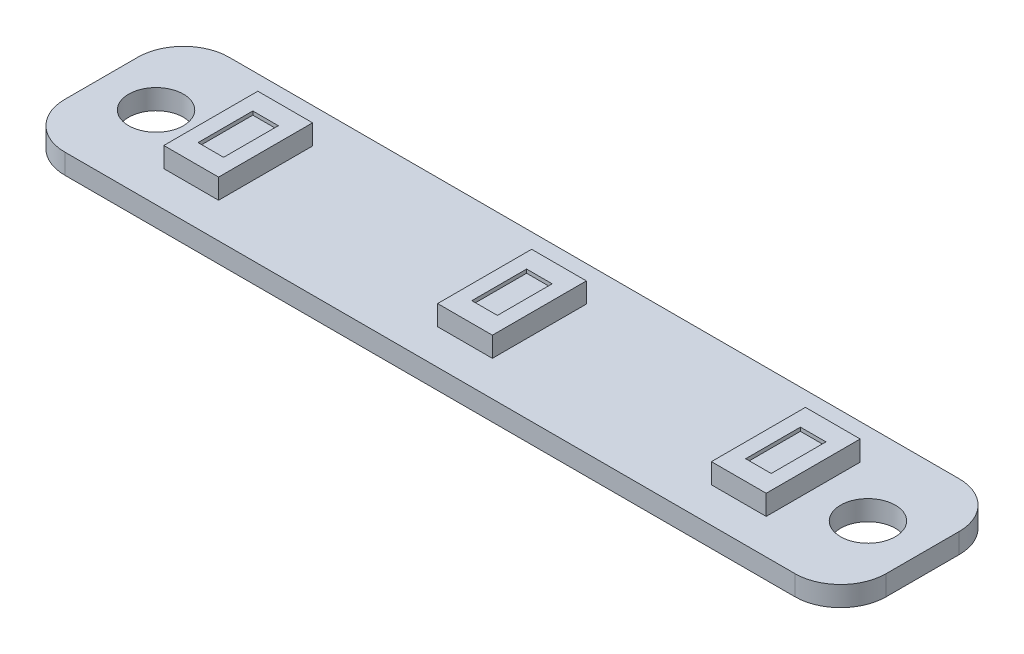
ISO-10303-21;
HEADER;
FILE_DESCRIPTION(('STEP AP214'),'2;1');
FILE_NAME('part.step','',(''),(''),'','','');
FILE_SCHEMA(('AUTOMOTIVE_DESIGN { 1 0 10303 214 1 1 1 1 }'));
ENDSEC;
DATA;
#1=APPLICATION_CONTEXT('core data for automotive mechanical design processes');
#2=APPLICATION_PROTOCOL_DEFINITION('international standard','automotive_design',2000,#1);
#3=PRODUCT_CONTEXT('',#1,'mechanical');
#4=PRODUCT('Part','Part','',(#3));
#5=PRODUCT_RELATED_PRODUCT_CATEGORY('part','',(#4));
#6=PRODUCT_DEFINITION_FORMATION('','',#4);
#7=PRODUCT_DEFINITION_CONTEXT('part definition',#1,'design');
#8=PRODUCT_DEFINITION('design','',#6,#7);
#9=PRODUCT_DEFINITION_SHAPE('','',#8);
#10=(LENGTH_UNIT() NAMED_UNIT(*) SI_UNIT(.MILLI.,.METRE.));
#11=(NAMED_UNIT(*) PLANE_ANGLE_UNIT() SI_UNIT($,.RADIAN.));
#12=(NAMED_UNIT(*) SI_UNIT($,.STERADIAN.) SOLID_ANGLE_UNIT());
#13=UNCERTAINTY_MEASURE_WITH_UNIT(LENGTH_MEASURE(1.E-05),#10,'distance_accuracy_value','');
#14=(GEOMETRIC_REPRESENTATION_CONTEXT(3) GLOBAL_UNCERTAINTY_ASSIGNED_CONTEXT((#13)) GLOBAL_UNIT_ASSIGNED_CONTEXT((#10,
#11,#12)) REPRESENTATION_CONTEXT('',''));
#15=CARTESIAN_POINT('',(0.,0.,0.));
#16=DIRECTION('',(0.,0.,1.));
#17=DIRECTION('',(1.,0.,0.));
#18=AXIS2_PLACEMENT_3D('',#15,#16,#17);
#19=CARTESIAN_POINT('',(20.,1.1,-2.));
#20=DIRECTION('',(0.,-1.,0.));
#21=DIRECTION('',(0.,0.,-1.));
#22=AXIS2_PLACEMENT_3D('',#19,#20,#21);
#23=PLANE('',#22);
#24=DIRECTION('',(0.,0.,-1.));
#25=VECTOR('',#24,1.);
#26=CARTESIAN_POINT('',(1.5,1.1,-2.575));
#27=LINE('',#26,#25);
#28=CARTESIAN_POINT('',(1.5,1.1,2.575));
#29=VERTEX_POINT('',#28);
#30=CARTESIAN_POINT('',(1.5,1.1,-2.575));
#31=VERTEX_POINT('',#30);
#32=EDGE_CURVE('E375',#29,#31,#27,.T.);
#33=ORIENTED_EDGE('',*,*,#32,.F.);
#34=DIRECTION('',(1.,0.,0.));
#35=VECTOR('',#34,1.);
#36=CARTESIAN_POINT('',(-1.5,1.1,2.575));
#37=LINE('',#36,#35);
#38=CARTESIAN_POINT('',(-1.5,1.1,2.575));
#39=VERTEX_POINT('',#38);
#40=EDGE_CURVE('E380',#39,#29,#37,.T.);
#41=ORIENTED_EDGE('',*,*,#40,.F.);
#42=DIRECTION('',(0.,0.,1.));
#43=VECTOR('',#42,1.);
#44=CARTESIAN_POINT('',(-1.5,1.1,-2.575));
#45=LINE('',#44,#43);
#46=CARTESIAN_POINT('',(-1.5,1.1,-2.575));
#47=VERTEX_POINT('',#46);
#48=EDGE_CURVE('E392',#47,#39,#45,.T.);
#49=ORIENTED_EDGE('',*,*,#48,.F.);
#50=DIRECTION('',(-1.,0.,0.));
#51=VECTOR('',#50,1.);
#52=CARTESIAN_POINT('',(-1.5,1.1,-2.575));
#53=LINE('',#52,#51);
#54=EDGE_CURVE('E389',#31,#47,#53,.T.);
#55=ORIENTED_EDGE('',*,*,#54,.F.);
#56=EDGE_LOOP('',(#33,#41,#49,#55));
#57=FACE_BOUND('',#56,.T.);
#58=CARTESIAN_POINT('',(19.5,1.1,0.));
#59=DIRECTION('',(0.,1.,0.));
#60=DIRECTION('',(0.,0.,-1.));
#61=AXIS2_PLACEMENT_3D('',#58,#59,#60);
#62=CIRCLE('',#61,1.5);
#63=CARTESIAN_POINT('',(19.5,1.1,-1.5));
#64=VERTEX_POINT('',#63);
#65=EDGE_CURVE('E442',#64,#64,#62,.T.);
#66=ORIENTED_EDGE('',*,*,#65,.F.);
#67=EDGE_LOOP('',(#66));
#68=FACE_BOUND('',#67,.T.);
#69=CARTESIAN_POINT('',(20.,1.1,-2.));
#70=DIRECTION('',(0.,1.,0.));
#71=DIRECTION('',(0.,0.,-1.));
#72=AXIS2_PLACEMENT_3D('',#69,#70,#71);
#73=CIRCLE('',#72,2.5);
#74=CARTESIAN_POINT('',(22.5,1.1,-1.99999999999998));
#75=VERTEX_POINT('',#74);
#76=CARTESIAN_POINT('',(20.,1.1,-4.5));
#77=VERTEX_POINT('',#76);
#78=EDGE_CURVE('E454',#75,#77,#73,.T.);
#79=ORIENTED_EDGE('',*,*,#78,.T.);
#80=DIRECTION('',(-1.,0.,0.));
#81=VECTOR('',#80,1.);
#82=CARTESIAN_POINT('',(-20.,1.1,-4.5));
#83=LINE('',#82,#81);
#84=CARTESIAN_POINT('',(-20.,1.1,-4.5));
#85=VERTEX_POINT('',#84);
#86=EDGE_CURVE('E457',#77,#85,#83,.T.);
#87=ORIENTED_EDGE('',*,*,#86,.T.);
#88=CARTESIAN_POINT('',(-20.,1.1,-2.));
#89=DIRECTION('',(0.,1.,0.));
#90=DIRECTION('',(0.,0.,1.));
#91=AXIS2_PLACEMENT_3D('',#88,#89,#90);
#92=CIRCLE('',#91,2.5);
#93=CARTESIAN_POINT('',(-22.5,1.1,-1.99999999999998));
#94=VERTEX_POINT('',#93);
#95=EDGE_CURVE('E460',#85,#94,#92,.T.);
#96=ORIENTED_EDGE('',*,*,#95,.T.);
#97=DIRECTION('',(0.,0.,1.));
#98=VECTOR('',#97,1.);
#99=CARTESIAN_POINT('',(-22.5,1.1,-1.99999999999998));
#100=LINE('',#99,#98);
#101=CARTESIAN_POINT('',(-22.5,1.1,1.99999999999998));
#102=VERTEX_POINT('',#101);
#103=EDGE_CURVE('E462',#94,#102,#100,.T.);
#104=ORIENTED_EDGE('',*,*,#103,.T.);
#105=CARTESIAN_POINT('',(-20.,1.1,2.));
#106=DIRECTION('',(0.,1.,0.));
#107=DIRECTION('',(0.,0.,1.));
#108=AXIS2_PLACEMENT_3D('',#105,#106,#107);
#109=CIRCLE('',#108,2.5);
#110=CARTESIAN_POINT('',(-20.,1.1,4.5));
#111=VERTEX_POINT('',#110);
#112=EDGE_CURVE('E464',#102,#111,#109,.T.);
#113=ORIENTED_EDGE('',*,*,#112,.T.);
#114=DIRECTION('',(1.,0.,0.));
#115=VECTOR('',#114,1.);
#116=CARTESIAN_POINT('',(-20.,1.1,4.5));
#117=LINE('',#116,#115);
#118=CARTESIAN_POINT('',(20.,1.1,4.5));
#119=VERTEX_POINT('',#118);
#120=EDGE_CURVE('E466',#111,#119,#117,.T.);
#121=ORIENTED_EDGE('',*,*,#120,.T.);
#122=CARTESIAN_POINT('',(20.,1.1,2.));
#123=DIRECTION('',(0.,1.,0.));
#124=DIRECTION('',(0.,0.,1.));
#125=AXIS2_PLACEMENT_3D('',#122,#123,#124);
#126=CIRCLE('',#125,2.5);
#127=CARTESIAN_POINT('',(22.5,1.1,1.99999999999998));
#128=VERTEX_POINT('',#127);
#129=EDGE_CURVE('E468',#119,#128,#126,.T.);
#130=ORIENTED_EDGE('',*,*,#129,.T.);
#131=DIRECTION('',(0.,0.,-1.));
#132=VECTOR('',#131,1.);
#133=CARTESIAN_POINT('',(22.5,1.1,-1.99999999999998));
#134=LINE('',#133,#132);
#135=EDGE_CURVE('E470',#128,#75,#134,.T.);
#136=ORIENTED_EDGE('',*,*,#135,.T.);
#137=EDGE_LOOP('',(#79,#87,#96,#104,#113,#121,#130,#136));
#138=FACE_BOUND('',#137,.T.);
#139=CARTESIAN_POINT('',(-19.5,1.1,0.));
#140=DIRECTION('',(0.,1.,0.));
#141=DIRECTION('',(0.,0.,1.));
#142=AXIS2_PLACEMENT_3D('',#139,#140,#141);
#143=CIRCLE('',#142,1.5);
#144=CARTESIAN_POINT('',(-19.5,1.1,1.5));
#145=VERTEX_POINT('',#144);
#146=EDGE_CURVE('E448',#145,#145,#143,.T.);
#147=ORIENTED_EDGE('',*,*,#146,.F.);
#148=EDGE_LOOP('',(#147));
#149=FACE_BOUND('',#148,.T.);
#150=DIRECTION('',(0.,0.,-1.));
#151=VECTOR('',#150,1.);
#152=CARTESIAN_POINT('',(-13.5,1.1,-2.575));
#153=LINE('',#152,#151);
#154=CARTESIAN_POINT('',(-13.5,1.1,2.575));
#155=VERTEX_POINT('',#154);
#156=CARTESIAN_POINT('',(-13.5,1.1,-2.575));
#157=VERTEX_POINT('',#156);
#158=EDGE_CURVE('E408',#155,#157,#153,.T.);
#159=ORIENTED_EDGE('',*,*,#158,.F.);
#160=DIRECTION('',(1.,0.,0.));
#161=VECTOR('',#160,1.);
#162=CARTESIAN_POINT('',(-16.5,1.1,2.575));
#163=LINE('',#162,#161);
#164=CARTESIAN_POINT('',(-16.5,1.1,2.575));
#165=VERTEX_POINT('',#164);
#166=EDGE_CURVE('E413',#165,#155,#163,.T.);
#167=ORIENTED_EDGE('',*,*,#166,.F.);
#168=DIRECTION('',(0.,0.,1.));
#169=VECTOR('',#168,1.);
#170=CARTESIAN_POINT('',(-16.5,1.1,-2.575));
#171=LINE('',#170,#169);
#172=CARTESIAN_POINT('',(-16.5,1.1,-2.575));
#173=VERTEX_POINT('',#172);
#174=EDGE_CURVE('E425',#173,#165,#171,.T.);
#175=ORIENTED_EDGE('',*,*,#174,.F.);
#176=DIRECTION('',(-1.,0.,0.));
#177=VECTOR('',#176,1.);
#178=CARTESIAN_POINT('',(-16.5,1.1,-2.575));
#179=LINE('',#178,#177);
#180=EDGE_CURVE('E422',#157,#173,#179,.T.);
#181=ORIENTED_EDGE('',*,*,#180,.F.);
#182=EDGE_LOOP('',(#159,#167,#175,#181));
#183=FACE_BOUND('',#182,.T.);
#184=DIRECTION('',(-1.,0.,0.));
#185=VECTOR('',#184,1.);
#186=CARTESIAN_POINT('',(16.5,1.1,-2.57500000000001));
#187=LINE('',#186,#185);
#188=CARTESIAN_POINT('',(16.5,1.1,-2.57500000000001));
#189=VERTEX_POINT('',#188);
#190=CARTESIAN_POINT('',(13.5,1.1,-2.57500000000001));
#191=VERTEX_POINT('',#190);
#192=EDGE_CURVE('E336',#189,#191,#187,.T.);
#193=ORIENTED_EDGE('',*,*,#192,.F.);
#194=DIRECTION('',(0.,0.,-1.));
#195=VECTOR('',#194,1.);
#196=CARTESIAN_POINT('',(16.5,1.1,-2.57500000000001));
#197=LINE('',#196,#195);
#198=CARTESIAN_POINT('',(16.5,1.1,2.57499999999999));
#199=VERTEX_POINT('',#198);
#200=EDGE_CURVE('E347',#199,#189,#197,.T.);
#201=ORIENTED_EDGE('',*,*,#200,.F.);
#202=DIRECTION('',(1.,0.,0.));
#203=VECTOR('',#202,1.);
#204=CARTESIAN_POINT('',(16.5,1.1,2.57499999999999));
#205=LINE('',#204,#203);
#206=CARTESIAN_POINT('',(13.5,1.1,2.57499999999999));
#207=VERTEX_POINT('',#206);
#208=EDGE_CURVE('E359',#207,#199,#205,.T.);
#209=ORIENTED_EDGE('',*,*,#208,.F.);
#210=DIRECTION('',(0.,0.,1.));
#211=VECTOR('',#210,1.);
#212=CARTESIAN_POINT('',(13.5,1.1,-2.57500000000001));
#213=LINE('',#212,#211);
#214=EDGE_CURVE('E356',#191,#207,#213,.T.);
#215=ORIENTED_EDGE('',*,*,#214,.F.);
#216=EDGE_LOOP('',(#193,#201,#209,#215));
#217=FACE_BOUND('',#216,.T.);
#218=ADVANCED_FACE('F33',(#57,#68,#138,#149,#183,#217),#23,.F.);
#219=CARTESIAN_POINT('',(20.,0.,-2.));
#220=DIRECTION('',(0.,-1.,0.));
#221=DIRECTION('',(0.,0.,-1.));
#222=AXIS2_PLACEMENT_3D('',#219,#220,#221);
#223=PLANE('',#222);
#224=CARTESIAN_POINT('',(-19.5,0.,0.));
#225=DIRECTION('',(0.,1.,0.));
#226=DIRECTION('',(0.,0.,1.));
#227=AXIS2_PLACEMENT_3D('',#224,#225,#226);
#228=CIRCLE('',#227,1.5);
#229=CARTESIAN_POINT('',(-19.5,0.,1.5));
#230=VERTEX_POINT('',#229);
#231=EDGE_CURVE('E445',#230,#230,#228,.T.);
#232=ORIENTED_EDGE('',*,*,#231,.T.);
#233=EDGE_LOOP('',(#232));
#234=FACE_BOUND('',#233,.T.);
#235=CARTESIAN_POINT('',(20.,0.,-2.));
#236=DIRECTION('',(0.,1.,0.));
#237=DIRECTION('',(0.,0.,-1.));
#238=AXIS2_PLACEMENT_3D('',#235,#236,#237);
#239=CIRCLE('',#238,2.5);
#240=CARTESIAN_POINT('',(22.5,0.,-1.99999999999998));
#241=VERTEX_POINT('',#240);
#242=CARTESIAN_POINT('',(20.,0.,-4.5));
#243=VERTEX_POINT('',#242);
#244=EDGE_CURVE('E451',#241,#243,#239,.T.);
#245=ORIENTED_EDGE('',*,*,#244,.F.);
#246=DIRECTION('',(0.,0.,-1.));
#247=VECTOR('',#246,1.);
#248=CARTESIAN_POINT('',(22.5,0.,-1.99999999999998));
#249=LINE('',#248,#247);
#250=CARTESIAN_POINT('',(22.5,0.,1.99999999999998));
#251=VERTEX_POINT('',#250);
#252=EDGE_CURVE('E458',#251,#241,#249,.T.);
#253=ORIENTED_EDGE('',*,*,#252,.F.);
#254=CARTESIAN_POINT('',(20.,0.,2.));
#255=DIRECTION('',(0.,1.,0.));
#256=DIRECTION('',(0.,0.,1.));
#257=AXIS2_PLACEMENT_3D('',#254,#255,#256);
#258=CIRCLE('',#257,2.5);
#259=CARTESIAN_POINT('',(20.,0.,4.5));
#260=VERTEX_POINT('',#259);
#261=EDGE_CURVE('E485',#260,#251,#258,.T.);
#262=ORIENTED_EDGE('',*,*,#261,.F.);
#263=DIRECTION('',(1.,0.,0.));
#264=VECTOR('',#263,1.);
#265=CARTESIAN_POINT('',(-20.,0.,4.5));
#266=LINE('',#265,#264);
#267=CARTESIAN_POINT('',(-20.,0.,4.5));
#268=VERTEX_POINT('',#267);
#269=EDGE_CURVE('E483',#268,#260,#266,.T.);
#270=ORIENTED_EDGE('',*,*,#269,.F.);
#271=CARTESIAN_POINT('',(-20.,0.,2.));
#272=DIRECTION('',(0.,1.,0.));
#273=DIRECTION('',(0.,0.,1.));
#274=AXIS2_PLACEMENT_3D('',#271,#272,#273);
#275=CIRCLE('',#274,2.5);
#276=CARTESIAN_POINT('',(-22.5,0.,1.99999999999998));
#277=VERTEX_POINT('',#276);
#278=EDGE_CURVE('E481',#277,#268,#275,.T.);
#279=ORIENTED_EDGE('',*,*,#278,.F.);
#280=DIRECTION('',(0.,0.,1.));
#281=VECTOR('',#280,1.);
#282=CARTESIAN_POINT('',(-22.5,0.,-1.99999999999998));
#283=LINE('',#282,#281);
#284=CARTESIAN_POINT('',(-22.5,0.,-1.99999999999998));
#285=VERTEX_POINT('',#284);
#286=EDGE_CURVE('E479',#285,#277,#283,.T.);
#287=ORIENTED_EDGE('',*,*,#286,.F.);
#288=CARTESIAN_POINT('',(-20.,0.,-2.));
#289=DIRECTION('',(0.,1.,0.));
#290=DIRECTION('',(0.,0.,1.));
#291=AXIS2_PLACEMENT_3D('',#288,#289,#290);
#292=CIRCLE('',#291,2.5);
#293=CARTESIAN_POINT('',(-20.,0.,-4.5));
#294=VERTEX_POINT('',#293);
#295=EDGE_CURVE('E477',#294,#285,#292,.T.);
#296=ORIENTED_EDGE('',*,*,#295,.F.);
#297=DIRECTION('',(-1.,0.,0.));
#298=VECTOR('',#297,1.);
#299=CARTESIAN_POINT('',(-20.,0.,-4.5));
#300=LINE('',#299,#298);
#301=EDGE_CURVE('E475',#243,#294,#300,.T.);
#302=ORIENTED_EDGE('',*,*,#301,.F.);
#303=EDGE_LOOP('',(#245,#253,#262,#270,#279,#287,#296,#302));
#304=FACE_BOUND('',#303,.T.);
#305=CARTESIAN_POINT('',(19.5,0.,0.));
#306=DIRECTION('',(0.,1.,0.));
#307=DIRECTION('',(0.,0.,-1.));
#308=AXIS2_PLACEMENT_3D('',#305,#306,#307);
#309=CIRCLE('',#308,1.5);
#310=CARTESIAN_POINT('',(19.5,0.,-1.5));
#311=VERTEX_POINT('',#310);
#312=EDGE_CURVE('E441',#311,#311,#309,.T.);
#313=ORIENTED_EDGE('',*,*,#312,.T.);
#314=EDGE_LOOP('',(#313));
#315=FACE_BOUND('',#314,.T.);
#316=ADVANCED_FACE('F515',(#234,#304,#315),#223,.T.);
#317=CARTESIAN_POINT('',(20.,1.1,-2.));
#318=DIRECTION('',(0.,-1.,0.));
#319=DIRECTION('',(0.,0.,-1.));
#320=AXIS2_PLACEMENT_3D('',#317,#318,#319);
#321=CYLINDRICAL_SURFACE('',#320,2.5);
#322=ORIENTED_EDGE('',*,*,#244,.T.);
#323=DIRECTION('',(0.,-1.,0.));
#324=VECTOR('',#323,1.);
#325=CARTESIAN_POINT('',(20.,1.1,-4.5));
#326=LINE('',#325,#324);
#327=EDGE_CURVE('E11',#77,#243,#326,.T.);
#328=ORIENTED_EDGE('',*,*,#327,.F.);
#329=ORIENTED_EDGE('',*,*,#78,.F.);
#330=DIRECTION('',(0.,-1.,0.));
#331=VECTOR('',#330,1.);
#332=CARTESIAN_POINT('',(22.5,1.1,-1.99999999999998));
#333=LINE('',#332,#331);
#334=EDGE_CURVE('E472',#75,#241,#333,.T.);
#335=ORIENTED_EDGE('',*,*,#334,.T.);
#336=EDGE_LOOP('',(#322,#328,#329,#335));
#337=FACE_BOUND('',#336,.T.);
#338=ADVANCED_FACE('F35',(#337),#321,.T.);
#339=CARTESIAN_POINT('',(-20.,1.1,-4.5));
#340=DIRECTION('',(0.,0.,1.));
#341=DIRECTION('',(1.,0.,0.));
#342=AXIS2_PLACEMENT_3D('',#339,#340,#341);
#343=PLANE('',#342);
#344=ORIENTED_EDGE('',*,*,#301,.T.);
#345=DIRECTION('',(0.,-1.,0.));
#346=VECTOR('',#345,1.);
#347=CARTESIAN_POINT('',(-20.,1.1,-4.5));
#348=LINE('',#347,#346);
#349=EDGE_CURVE('E41',#85,#294,#348,.T.);
#350=ORIENTED_EDGE('',*,*,#349,.F.);
#351=ORIENTED_EDGE('',*,*,#86,.F.);
#352=ORIENTED_EDGE('',*,*,#327,.T.);
#353=EDGE_LOOP('',(#344,#350,#351,#352));
#354=FACE_BOUND('',#353,.T.);
#355=ADVANCED_FACE('F533',(#354),#343,.F.);
#356=CARTESIAN_POINT('',(-20.,1.1,-2.));
#357=DIRECTION('',(0.,-1.,0.));
#358=DIRECTION('',(0.,0.,-1.));
#359=AXIS2_PLACEMENT_3D('',#356,#357,#358);
#360=CYLINDRICAL_SURFACE('',#359,2.5);
#361=ORIENTED_EDGE('',*,*,#295,.T.);
#362=DIRECTION('',(0.,-1.,0.));
#363=VECTOR('',#362,1.);
#364=CARTESIAN_POINT('',(-22.5,1.1,-1.99999999999998));
#365=LINE('',#364,#363);
#366=EDGE_CURVE('E502',#94,#285,#365,.T.);
#367=ORIENTED_EDGE('',*,*,#366,.F.);
#368=ORIENTED_EDGE('',*,*,#95,.F.);
#369=ORIENTED_EDGE('',*,*,#349,.T.);
#370=EDGE_LOOP('',(#361,#367,#368,#369));
#371=FACE_BOUND('',#370,.T.);
#372=ADVANCED_FACE('F509',(#371),#360,.T.);
#373=CARTESIAN_POINT('',(-22.5,1.1,-1.99999999999998));
#374=DIRECTION('',(1.,0.,0.));
#375=DIRECTION('',(0.,0.,-1.));
#376=AXIS2_PLACEMENT_3D('',#373,#374,#375);
#377=PLANE('',#376);
#378=ORIENTED_EDGE('',*,*,#286,.T.);
#379=DIRECTION('',(0.,-1.,0.));
#380=VECTOR('',#379,1.);
#381=CARTESIAN_POINT('',(-22.5,1.1,1.99999999999998));
#382=LINE('',#381,#380);
#383=EDGE_CURVE('E499',#102,#277,#382,.T.);
#384=ORIENTED_EDGE('',*,*,#383,.F.);
#385=ORIENTED_EDGE('',*,*,#103,.F.);
#386=ORIENTED_EDGE('',*,*,#366,.T.);
#387=EDGE_LOOP('',(#378,#384,#385,#386));
#388=FACE_BOUND('',#387,.T.);
#389=ADVANCED_FACE('F521',(#388),#377,.F.);
#390=CARTESIAN_POINT('',(-20.,1.1,2.));
#391=DIRECTION('',(0.,-1.,0.));
#392=DIRECTION('',(0.,0.,-1.));
#393=AXIS2_PLACEMENT_3D('',#390,#391,#392);
#394=CYLINDRICAL_SURFACE('',#393,2.5);
#395=ORIENTED_EDGE('',*,*,#278,.T.);
#396=DIRECTION('',(0.,-1.,0.));
#397=VECTOR('',#396,1.);
#398=CARTESIAN_POINT('',(-20.,1.1,4.5));
#399=LINE('',#398,#397);
#400=EDGE_CURVE('E496',#111,#268,#399,.T.);
#401=ORIENTED_EDGE('',*,*,#400,.F.);
#402=ORIENTED_EDGE('',*,*,#112,.F.);
#403=ORIENTED_EDGE('',*,*,#383,.T.);
#404=EDGE_LOOP('',(#395,#401,#402,#403));
#405=FACE_BOUND('',#404,.T.);
#406=ADVANCED_FACE('F525',(#405),#394,.T.);
#407=CARTESIAN_POINT('',(-20.,1.1,4.5));
#408=DIRECTION('',(0.,0.,-1.));
#409=DIRECTION('',(-1.,0.,0.));
#410=AXIS2_PLACEMENT_3D('',#407,#408,#409);
#411=PLANE('',#410);
#412=ORIENTED_EDGE('',*,*,#269,.T.);
#413=DIRECTION('',(0.,-1.,0.));
#414=VECTOR('',#413,1.);
#415=CARTESIAN_POINT('',(20.,1.1,4.5));
#416=LINE('',#415,#414);
#417=EDGE_CURVE('E493',#119,#260,#416,.T.);
#418=ORIENTED_EDGE('',*,*,#417,.F.);
#419=ORIENTED_EDGE('',*,*,#120,.F.);
#420=ORIENTED_EDGE('',*,*,#400,.T.);
#421=EDGE_LOOP('',(#412,#418,#419,#420));
#422=FACE_BOUND('',#421,.T.);
#423=ADVANCED_FACE('F546',(#422),#411,.F.);
#424=CARTESIAN_POINT('',(20.,1.1,2.));
#425=DIRECTION('',(0.,-1.,0.));
#426=DIRECTION('',(0.,0.,-1.));
#427=AXIS2_PLACEMENT_3D('',#424,#425,#426);
#428=CYLINDRICAL_SURFACE('',#427,2.5);
#429=ORIENTED_EDGE('',*,*,#261,.T.);
#430=DIRECTION('',(0.,-1.,0.));
#431=VECTOR('',#430,1.);
#432=CARTESIAN_POINT('',(22.5,1.1,1.99999999999998));
#433=LINE('',#432,#431);
#434=EDGE_CURVE('E490',#128,#251,#433,.T.);
#435=ORIENTED_EDGE('',*,*,#434,.F.);
#436=ORIENTED_EDGE('',*,*,#129,.F.);
#437=ORIENTED_EDGE('',*,*,#417,.T.);
#438=EDGE_LOOP('',(#429,#435,#436,#437));
#439=FACE_BOUND('',#438,.T.);
#440=ADVANCED_FACE('F544',(#439),#428,.T.);
#441=CARTESIAN_POINT('',(22.5,1.1,-1.99999999999998));
#442=DIRECTION('',(-1.,0.,0.));
#443=DIRECTION('',(0.,0.,1.));
#444=AXIS2_PLACEMENT_3D('',#441,#442,#443);
#445=PLANE('',#444);
#446=ORIENTED_EDGE('',*,*,#252,.T.);
#447=ORIENTED_EDGE('',*,*,#334,.F.);
#448=ORIENTED_EDGE('',*,*,#135,.F.);
#449=ORIENTED_EDGE('',*,*,#434,.T.);
#450=EDGE_LOOP('',(#446,#447,#448,#449));
#451=FACE_BOUND('',#450,.T.);
#452=ADVANCED_FACE('F539',(#451),#445,.F.);
#453=CARTESIAN_POINT('',(-19.5,1.1,0.));
#454=DIRECTION('',(0.,-1.,0.));
#455=DIRECTION('',(0.,0.,-1.));
#456=AXIS2_PLACEMENT_3D('',#453,#454,#455);
#457=CYLINDRICAL_SURFACE('',#456,1.5);
#458=ORIENTED_EDGE('',*,*,#146,.T.);
#459=EDGE_LOOP('',(#458));
#460=FACE_BOUND('',#459,.T.);
#461=ORIENTED_EDGE('',*,*,#231,.F.);
#462=EDGE_LOOP('',(#461));
#463=FACE_BOUND('',#462,.T.);
#464=ADVANCED_FACE('F565',(#460,#463),#457,.F.);
#465=CARTESIAN_POINT('',(19.5,1.1,0.));
#466=DIRECTION('',(0.,-1.,0.));
#467=DIRECTION('',(0.,0.,-1.));
#468=AXIS2_PLACEMENT_3D('',#465,#466,#467);
#469=CYLINDRICAL_SURFACE('',#468,1.5);
#470=ORIENTED_EDGE('',*,*,#65,.T.);
#471=EDGE_LOOP('',(#470));
#472=FACE_BOUND('',#471,.T.);
#473=ORIENTED_EDGE('',*,*,#312,.F.);
#474=EDGE_LOOP('',(#473));
#475=FACE_BOUND('',#474,.T.);
#476=ADVANCED_FACE('F572',(#472,#475),#469,.F.);
#477=CARTESIAN_POINT('',(-13.5,2.2,-2.575));
#478=DIRECTION('',(-1.,0.,0.));
#479=DIRECTION('',(0.,0.,1.));
#480=AXIS2_PLACEMENT_3D('',#477,#478,#479);
#481=PLANE('',#480);
#482=ORIENTED_EDGE('',*,*,#158,.T.);
#483=DIRECTION('',(0.,-1.,0.));
#484=VECTOR('',#483,1.);
#485=CARTESIAN_POINT('',(-13.5,2.2,-2.575));
#486=LINE('',#485,#484);
#487=CARTESIAN_POINT('',(-13.5,2.2,-2.575));
#488=VERTEX_POINT('',#487);
#489=EDGE_CURVE('E438',#488,#157,#486,.T.);
#490=ORIENTED_EDGE('',*,*,#489,.F.);
#491=DIRECTION('',(0.,0.,-1.));
#492=VECTOR('',#491,1.);
#493=CARTESIAN_POINT('',(-13.5,2.2,-2.575));
#494=LINE('',#493,#492);
#495=CARTESIAN_POINT('',(-13.5,2.2,2.575));
#496=VERTEX_POINT('',#495);
#497=EDGE_CURVE('E409',#496,#488,#494,.T.);
#498=ORIENTED_EDGE('',*,*,#497,.F.);
#499=DIRECTION('',(0.,-1.,0.));
#500=VECTOR('',#499,1.);
#501=CARTESIAN_POINT('',(-13.5,2.2,2.575));
#502=LINE('',#501,#500);
#503=EDGE_CURVE('E419',#496,#155,#502,.T.);
#504=ORIENTED_EDGE('',*,*,#503,.T.);
#505=EDGE_LOOP('',(#482,#490,#498,#504));
#506=FACE_BOUND('',#505,.T.);
#507=ADVANCED_FACE('F577',(#506),#481,.F.);
#508=CARTESIAN_POINT('',(-16.5,2.2,-2.575));
#509=DIRECTION('',(0.,0.,1.));
#510=DIRECTION('',(1.,0.,0.));
#511=AXIS2_PLACEMENT_3D('',#508,#509,#510);
#512=PLANE('',#511);
#513=ORIENTED_EDGE('',*,*,#180,.T.);
#514=DIRECTION('',(0.,-1.,0.));
#515=VECTOR('',#514,1.);
#516=CARTESIAN_POINT('',(-16.5,2.2,-2.575));
#517=LINE('',#516,#515);
#518=CARTESIAN_POINT('',(-16.5,2.2,-2.575));
#519=VERTEX_POINT('',#518);
#520=EDGE_CURVE('E435',#519,#173,#517,.T.);
#521=ORIENTED_EDGE('',*,*,#520,.F.);
#522=DIRECTION('',(-1.,0.,0.));
#523=VECTOR('',#522,1.);
#524=CARTESIAN_POINT('',(-16.5,2.2,-2.575));
#525=LINE('',#524,#523);
#526=EDGE_CURVE('E412',#488,#519,#525,.T.);
#527=ORIENTED_EDGE('',*,*,#526,.F.);
#528=ORIENTED_EDGE('',*,*,#489,.T.);
#529=EDGE_LOOP('',(#513,#521,#527,#528));
#530=FACE_BOUND('',#529,.T.);
#531=ADVANCED_FACE('F642',(#530),#512,.F.);
#532=CARTESIAN_POINT('',(-16.5,2.2,-2.575));
#533=DIRECTION('',(1.,0.,0.));
#534=DIRECTION('',(0.,0.,-1.));
#535=AXIS2_PLACEMENT_3D('',#532,#533,#534);
#536=PLANE('',#535);
#537=ORIENTED_EDGE('',*,*,#174,.T.);
#538=DIRECTION('',(0.,-1.,0.));
#539=VECTOR('',#538,1.);
#540=CARTESIAN_POINT('',(-16.5,2.2,2.575));
#541=LINE('',#540,#539);
#542=CARTESIAN_POINT('',(-16.5,2.2,2.575));
#543=VERTEX_POINT('',#542);
#544=EDGE_CURVE('E432',#543,#165,#541,.T.);
#545=ORIENTED_EDGE('',*,*,#544,.F.);
#546=DIRECTION('',(0.,0.,1.));
#547=VECTOR('',#546,1.);
#548=CARTESIAN_POINT('',(-16.5,2.2,-2.575));
#549=LINE('',#548,#547);
#550=EDGE_CURVE('E415',#519,#543,#549,.T.);
#551=ORIENTED_EDGE('',*,*,#550,.F.);
#552=ORIENTED_EDGE('',*,*,#520,.T.);
#553=EDGE_LOOP('',(#537,#545,#551,#552));
#554=FACE_BOUND('',#553,.T.);
#555=ADVANCED_FACE('F638',(#554),#536,.F.);
#556=CARTESIAN_POINT('',(-16.5,2.2,2.575));
#557=DIRECTION('',(0.,0.,-1.));
#558=DIRECTION('',(-1.,0.,0.));
#559=AXIS2_PLACEMENT_3D('',#556,#557,#558);
#560=PLANE('',#559);
#561=ORIENTED_EDGE('',*,*,#166,.T.);
#562=ORIENTED_EDGE('',*,*,#503,.F.);
#563=DIRECTION('',(1.,0.,0.));
#564=VECTOR('',#563,1.);
#565=CARTESIAN_POINT('',(-16.5,2.2,2.575));
#566=LINE('',#565,#564);
#567=EDGE_CURVE('E417',#543,#496,#566,.T.);
#568=ORIENTED_EDGE('',*,*,#567,.F.);
#569=ORIENTED_EDGE('',*,*,#544,.T.);
#570=EDGE_LOOP('',(#561,#562,#568,#569));
#571=FACE_BOUND('',#570,.T.);
#572=ADVANCED_FACE('F634',(#571),#560,.F.);
#573=CARTESIAN_POINT('',(0.,2.2,0.));
#574=DIRECTION('',(0.,1.,0.));
#575=DIRECTION('',(0.,0.,1.));
#576=AXIS2_PLACEMENT_3D('',#573,#574,#575);
#577=PLANE('',#576);
#578=DIRECTION('',(0.,0.,-1.));
#579=VECTOR('',#578,1.);
#580=CARTESIAN_POINT('',(-14.3,2.2,-1.5));
#581=LINE('',#580,#579);
#582=CARTESIAN_POINT('',(-14.3,2.2,1.5));
#583=VERTEX_POINT('',#582);
#584=CARTESIAN_POINT('',(-14.3,2.2,-1.5));
#585=VERTEX_POINT('',#584);
#586=EDGE_CURVE('E305',#583,#585,#581,.T.);
#587=ORIENTED_EDGE('',*,*,#586,.F.);
#588=DIRECTION('',(1.,0.,0.));
#589=VECTOR('',#588,1.);
#590=CARTESIAN_POINT('',(-15.7,2.2,1.5));
#591=LINE('',#590,#589);
#592=CARTESIAN_POINT('',(-15.7,2.2,1.5));
#593=VERTEX_POINT('',#592);
#594=EDGE_CURVE('E315',#593,#583,#591,.T.);
#595=ORIENTED_EDGE('',*,*,#594,.F.);
#596=DIRECTION('',(0.,0.,1.));
#597=VECTOR('',#596,1.);
#598=CARTESIAN_POINT('',(-15.7,2.2,-1.5));
#599=LINE('',#598,#597);
#600=CARTESIAN_POINT('',(-15.7,2.2,-1.5));
#601=VERTEX_POINT('',#600);
#602=EDGE_CURVE('E329',#601,#593,#599,.T.);
#603=ORIENTED_EDGE('',*,*,#602,.F.);
#604=DIRECTION('',(-1.,0.,0.));
#605=VECTOR('',#604,1.);
#606=CARTESIAN_POINT('',(-15.7,2.2,-1.5));
#607=LINE('',#606,#605);
#608=EDGE_CURVE('E326',#585,#601,#607,.T.);
#609=ORIENTED_EDGE('',*,*,#608,.F.);
#610=EDGE_LOOP('',(#587,#595,#603,#609));
#611=FACE_BOUND('',#610,.T.);
#612=ORIENTED_EDGE('',*,*,#497,.T.);
#613=ORIENTED_EDGE('',*,*,#526,.T.);
#614=ORIENTED_EDGE('',*,*,#550,.T.);
#615=ORIENTED_EDGE('',*,*,#567,.T.);
#616=EDGE_LOOP('',(#612,#613,#614,#615));
#617=FACE_BOUND('',#616,.T.);
#618=ADVANCED_FACE('F630',(#611,#617),#577,.T.);
#619=CARTESIAN_POINT('',(1.5,2.2,-2.575));
#620=DIRECTION('',(-1.,0.,0.));
#621=DIRECTION('',(0.,0.,1.));
#622=AXIS2_PLACEMENT_3D('',#619,#620,#621);
#623=PLANE('',#622);
#624=ORIENTED_EDGE('',*,*,#32,.T.);
#625=DIRECTION('',(0.,-1.,0.));
#626=VECTOR('',#625,1.);
#627=CARTESIAN_POINT('',(1.5,2.2,-2.575));
#628=LINE('',#627,#626);
#629=CARTESIAN_POINT('',(1.5,2.2,-2.575));
#630=VERTEX_POINT('',#629);
#631=EDGE_CURVE('E405',#630,#31,#628,.T.);
#632=ORIENTED_EDGE('',*,*,#631,.F.);
#633=DIRECTION('',(0.,0.,-1.));
#634=VECTOR('',#633,1.);
#635=CARTESIAN_POINT('',(1.5,2.2,-2.575));
#636=LINE('',#635,#634);
#637=CARTESIAN_POINT('',(1.5,2.2,2.575));
#638=VERTEX_POINT('',#637);
#639=EDGE_CURVE('E376',#638,#630,#636,.T.);
#640=ORIENTED_EDGE('',*,*,#639,.F.);
#641=DIRECTION('',(0.,-1.,0.));
#642=VECTOR('',#641,1.);
#643=CARTESIAN_POINT('',(1.5,2.2,2.575));
#644=LINE('',#643,#642);
#645=EDGE_CURVE('E386',#638,#29,#644,.T.);
#646=ORIENTED_EDGE('',*,*,#645,.T.);
#647=EDGE_LOOP('',(#624,#632,#640,#646));
#648=FACE_BOUND('',#647,.T.);
#649=ADVANCED_FACE('F626',(#648),#623,.F.);
#650=CARTESIAN_POINT('',(-1.5,2.2,-2.575));
#651=DIRECTION('',(0.,0.,1.));
#652=DIRECTION('',(1.,0.,0.));
#653=AXIS2_PLACEMENT_3D('',#650,#651,#652);
#654=PLANE('',#653);
#655=ORIENTED_EDGE('',*,*,#54,.T.);
#656=DIRECTION('',(0.,-1.,0.));
#657=VECTOR('',#656,1.);
#658=CARTESIAN_POINT('',(-1.5,2.2,-2.575));
#659=LINE('',#658,#657);
#660=CARTESIAN_POINT('',(-1.5,2.2,-2.575));
#661=VERTEX_POINT('',#660);
#662=EDGE_CURVE('E402',#661,#47,#659,.T.);
#663=ORIENTED_EDGE('',*,*,#662,.F.);
#664=DIRECTION('',(-1.,0.,0.));
#665=VECTOR('',#664,1.);
#666=CARTESIAN_POINT('',(-1.5,2.2,-2.575));
#667=LINE('',#666,#665);
#668=EDGE_CURVE('E379',#630,#661,#667,.T.);
#669=ORIENTED_EDGE('',*,*,#668,.F.);
#670=ORIENTED_EDGE('',*,*,#631,.T.);
#671=EDGE_LOOP('',(#655,#663,#669,#670));
#672=FACE_BOUND('',#671,.T.);
#673=ADVANCED_FACE('F622',(#672),#654,.F.);
#674=CARTESIAN_POINT('',(-1.5,2.2,-2.575));
#675=DIRECTION('',(1.,0.,0.));
#676=DIRECTION('',(0.,0.,-1.));
#677=AXIS2_PLACEMENT_3D('',#674,#675,#676);
#678=PLANE('',#677);
#679=ORIENTED_EDGE('',*,*,#48,.T.);
#680=DIRECTION('',(0.,-1.,0.));
#681=VECTOR('',#680,1.);
#682=CARTESIAN_POINT('',(-1.5,2.2,2.575));
#683=LINE('',#682,#681);
#684=CARTESIAN_POINT('',(-1.5,2.2,2.575));
#685=VERTEX_POINT('',#684);
#686=EDGE_CURVE('E399',#685,#39,#683,.T.);
#687=ORIENTED_EDGE('',*,*,#686,.F.);
#688=DIRECTION('',(0.,0.,1.));
#689=VECTOR('',#688,1.);
#690=CARTESIAN_POINT('',(-1.5,2.2,-2.575));
#691=LINE('',#690,#689);
#692=EDGE_CURVE('E382',#661,#685,#691,.T.);
#693=ORIENTED_EDGE('',*,*,#692,.F.);
#694=ORIENTED_EDGE('',*,*,#662,.T.);
#695=EDGE_LOOP('',(#679,#687,#693,#694));
#696=FACE_BOUND('',#695,.T.);
#697=ADVANCED_FACE('F618',(#696),#678,.F.);
#698=CARTESIAN_POINT('',(-1.5,2.2,2.575));
#699=DIRECTION('',(0.,0.,-1.));
#700=DIRECTION('',(-1.,0.,0.));
#701=AXIS2_PLACEMENT_3D('',#698,#699,#700);
#702=PLANE('',#701);
#703=ORIENTED_EDGE('',*,*,#40,.T.);
#704=ORIENTED_EDGE('',*,*,#645,.F.);
#705=DIRECTION('',(1.,0.,0.));
#706=VECTOR('',#705,1.);
#707=CARTESIAN_POINT('',(-1.5,2.2,2.575));
#708=LINE('',#707,#706);
#709=EDGE_CURVE('E384',#685,#638,#708,.T.);
#710=ORIENTED_EDGE('',*,*,#709,.F.);
#711=ORIENTED_EDGE('',*,*,#686,.T.);
#712=EDGE_LOOP('',(#703,#704,#710,#711));
#713=FACE_BOUND('',#712,.T.);
#714=ADVANCED_FACE('F614',(#713),#702,.F.);
#715=CARTESIAN_POINT('',(0.,2.2,0.));
#716=DIRECTION('',(0.,1.,0.));
#717=DIRECTION('',(0.,0.,1.));
#718=AXIS2_PLACEMENT_3D('',#715,#716,#717);
#719=PLANE('',#718);
#720=DIRECTION('',(0.,0.,-1.));
#721=VECTOR('',#720,1.);
#722=CARTESIAN_POINT('',(0.7,2.2,-1.5));
#723=LINE('',#722,#721);
#724=CARTESIAN_POINT('',(0.700000000000001,2.2,1.5));
#725=VERTEX_POINT('',#724);
#726=CARTESIAN_POINT('',(0.7,2.2,-1.5));
#727=VERTEX_POINT('',#726);
#728=EDGE_CURVE('E56',#725,#727,#723,.T.);
#729=ORIENTED_EDGE('',*,*,#728,.F.);
#730=DIRECTION('',(1.,0.,0.));
#731=VECTOR('',#730,1.);
#732=CARTESIAN_POINT('',(-0.7,2.2,1.5));
#733=LINE('',#732,#731);
#734=CARTESIAN_POINT('',(-0.7,2.2,1.5));
#735=VERTEX_POINT('',#734);
#736=EDGE_CURVE('E284',#735,#725,#733,.T.);
#737=ORIENTED_EDGE('',*,*,#736,.F.);
#738=DIRECTION('',(0.,0.,1.));
#739=VECTOR('',#738,1.);
#740=CARTESIAN_POINT('',(-0.7,2.2,-1.5));
#741=LINE('',#740,#739);
#742=CARTESIAN_POINT('',(-0.7,2.2,-1.5));
#743=VERTEX_POINT('',#742);
#744=EDGE_CURVE('E298',#743,#735,#741,.T.);
#745=ORIENTED_EDGE('',*,*,#744,.F.);
#746=DIRECTION('',(-1.,0.,0.));
#747=VECTOR('',#746,1.);
#748=CARTESIAN_POINT('',(-0.7,2.2,-1.5));
#749=LINE('',#748,#747);
#750=EDGE_CURVE('E295',#727,#743,#749,.T.);
#751=ORIENTED_EDGE('',*,*,#750,.F.);
#752=EDGE_LOOP('',(#729,#737,#745,#751));
#753=FACE_BOUND('',#752,.T.);
#754=ORIENTED_EDGE('',*,*,#639,.T.);
#755=ORIENTED_EDGE('',*,*,#668,.T.);
#756=ORIENTED_EDGE('',*,*,#692,.T.);
#757=ORIENTED_EDGE('',*,*,#709,.T.);
#758=EDGE_LOOP('',(#754,#755,#756,#757));
#759=FACE_BOUND('',#758,.T.);
#760=ADVANCED_FACE('F608',(#753,#759),#719,.T.);
#761=CARTESIAN_POINT('',(16.5,2.2,-2.57500000000001));
#762=DIRECTION('',(0.,0.,1.));
#763=DIRECTION('',(1.,0.,0.));
#764=AXIS2_PLACEMENT_3D('',#761,#762,#763);
#765=PLANE('',#764);
#766=ORIENTED_EDGE('',*,*,#192,.T.);
#767=DIRECTION('',(0.,-1.,0.));
#768=VECTOR('',#767,1.);
#769=CARTESIAN_POINT('',(13.5,2.2,-2.57500000000001));
#770=LINE('',#769,#768);
#771=CARTESIAN_POINT('',(13.5,2.2,-2.57500000000001));
#772=VERTEX_POINT('',#771);
#773=EDGE_CURVE('E372',#772,#191,#770,.T.);
#774=ORIENTED_EDGE('',*,*,#773,.F.);
#775=DIRECTION('',(-1.,0.,0.));
#776=VECTOR('',#775,1.);
#777=CARTESIAN_POINT('',(16.5,2.2,-2.57500000000001));
#778=LINE('',#777,#776);
#779=CARTESIAN_POINT('',(16.5,2.2,-2.57500000000001));
#780=VERTEX_POINT('',#779);
#781=EDGE_CURVE('E343',#780,#772,#778,.T.);
#782=ORIENTED_EDGE('',*,*,#781,.F.);
#783=DIRECTION('',(0.,-1.,0.));
#784=VECTOR('',#783,1.);
#785=CARTESIAN_POINT('',(16.5,2.2,-2.57500000000001));
#786=LINE('',#785,#784);
#787=EDGE_CURVE('E353',#780,#189,#786,.T.);
#788=ORIENTED_EDGE('',*,*,#787,.T.);
#789=EDGE_LOOP('',(#766,#774,#782,#788));
#790=FACE_BOUND('',#789,.T.);
#791=ADVANCED_FACE('F592',(#790),#765,.F.);
#792=CARTESIAN_POINT('',(13.5,2.2,-2.57500000000001));
#793=DIRECTION('',(1.,0.,0.));
#794=DIRECTION('',(0.,0.,-1.));
#795=AXIS2_PLACEMENT_3D('',#792,#793,#794);
#796=PLANE('',#795);
#797=ORIENTED_EDGE('',*,*,#214,.T.);
#798=DIRECTION('',(0.,-1.,0.));
#799=VECTOR('',#798,1.);
#800=CARTESIAN_POINT('',(13.5,2.2,2.57499999999999));
#801=LINE('',#800,#799);
#802=CARTESIAN_POINT('',(13.5,2.2,2.57499999999999));
#803=VERTEX_POINT('',#802);
#804=EDGE_CURVE('E369',#803,#207,#801,.T.);
#805=ORIENTED_EDGE('',*,*,#804,.F.);
#806=DIRECTION('',(0.,0.,1.));
#807=VECTOR('',#806,1.);
#808=CARTESIAN_POINT('',(13.5,2.2,-2.57500000000001));
#809=LINE('',#808,#807);
#810=EDGE_CURVE('E346',#772,#803,#809,.T.);
#811=ORIENTED_EDGE('',*,*,#810,.F.);
#812=ORIENTED_EDGE('',*,*,#773,.T.);
#813=EDGE_LOOP('',(#797,#805,#811,#812));
#814=FACE_BOUND('',#813,.T.);
#815=ADVANCED_FACE('F600',(#814),#796,.F.);
#816=CARTESIAN_POINT('',(16.5,2.2,2.57499999999999));
#817=DIRECTION('',(0.,0.,-1.));
#818=DIRECTION('',(-1.,0.,0.));
#819=AXIS2_PLACEMENT_3D('',#816,#817,#818);
#820=PLANE('',#819);
#821=ORIENTED_EDGE('',*,*,#208,.T.);
#822=DIRECTION('',(0.,-1.,0.));
#823=VECTOR('',#822,1.);
#824=CARTESIAN_POINT('',(16.5,2.2,2.57499999999999));
#825=LINE('',#824,#823);
#826=CARTESIAN_POINT('',(16.5,2.2,2.57499999999999));
#827=VERTEX_POINT('',#826);
#828=EDGE_CURVE('E366',#827,#199,#825,.T.);
#829=ORIENTED_EDGE('',*,*,#828,.F.);
#830=DIRECTION('',(1.,0.,0.));
#831=VECTOR('',#830,1.);
#832=CARTESIAN_POINT('',(16.5,2.2,2.57499999999999));
#833=LINE('',#832,#831);
#834=EDGE_CURVE('E349',#803,#827,#833,.T.);
#835=ORIENTED_EDGE('',*,*,#834,.F.);
#836=ORIENTED_EDGE('',*,*,#804,.T.);
#837=EDGE_LOOP('',(#821,#829,#835,#836));
#838=FACE_BOUND('',#837,.T.);
#839=ADVANCED_FACE('F598',(#838),#820,.F.);
#840=CARTESIAN_POINT('',(16.5,2.2,-2.57500000000001));
#841=DIRECTION('',(-1.,0.,0.));
#842=DIRECTION('',(0.,0.,1.));
#843=AXIS2_PLACEMENT_3D('',#840,#841,#842);
#844=PLANE('',#843);
#845=ORIENTED_EDGE('',*,*,#200,.T.);
#846=ORIENTED_EDGE('',*,*,#787,.F.);
#847=DIRECTION('',(0.,0.,-1.));
#848=VECTOR('',#847,1.);
#849=CARTESIAN_POINT('',(16.5,2.2,-2.57500000000001));
#850=LINE('',#849,#848);
#851=EDGE_CURVE('E351',#827,#780,#850,.T.);
#852=ORIENTED_EDGE('',*,*,#851,.F.);
#853=ORIENTED_EDGE('',*,*,#828,.T.);
#854=EDGE_LOOP('',(#845,#846,#852,#853));
#855=FACE_BOUND('',#854,.T.);
#856=ADVANCED_FACE('F588',(#855),#844,.F.);
#857=CARTESIAN_POINT('',(0.,2.2,0.));
#858=DIRECTION('',(0.,1.,0.));
#859=DIRECTION('',(0.,0.,1.));
#860=AXIS2_PLACEMENT_3D('',#857,#858,#859);
#861=PLANE('',#860);
#862=DIRECTION('',(0.,0.,-1.));
#863=VECTOR('',#862,1.);
#864=CARTESIAN_POINT('',(15.7,2.2,-1.5));
#865=LINE('',#864,#863);
#866=CARTESIAN_POINT('',(15.7,2.2,1.49999999999999));
#867=VERTEX_POINT('',#866);
#868=CARTESIAN_POINT('',(15.7,2.2,-1.5));
#869=VERTEX_POINT('',#868);
#870=EDGE_CURVE('E48',#867,#869,#865,.T.);
#871=ORIENTED_EDGE('',*,*,#870,.F.);
#872=DIRECTION('',(1.,0.,0.));
#873=VECTOR('',#872,1.);
#874=CARTESIAN_POINT('',(15.7,2.2,1.49999999999999));
#875=LINE('',#874,#873);
#876=CARTESIAN_POINT('',(14.3,2.2,1.49999999999999));
#877=VERTEX_POINT('',#876);
#878=EDGE_CURVE('E262',#877,#867,#875,.T.);
#879=ORIENTED_EDGE('',*,*,#878,.F.);
#880=DIRECTION('',(0.,0.,1.));
#881=VECTOR('',#880,1.);
#882=CARTESIAN_POINT('',(14.3,2.2,-1.5));
#883=LINE('',#882,#881);
#884=CARTESIAN_POINT('',(14.3,2.2,-1.5));
#885=VERTEX_POINT('',#884);
#886=EDGE_CURVE('E265',#885,#877,#883,.T.);
#887=ORIENTED_EDGE('',*,*,#886,.F.);
#888=DIRECTION('',(-1.,0.,0.));
#889=VECTOR('',#888,1.);
#890=CARTESIAN_POINT('',(15.7,2.2,-1.5));
#891=LINE('',#890,#889);
#892=EDGE_CURVE('E271',#869,#885,#891,.T.);
#893=ORIENTED_EDGE('',*,*,#892,.F.);
#894=EDGE_LOOP('',(#871,#879,#887,#893));
#895=FACE_BOUND('',#894,.T.);
#896=ORIENTED_EDGE('',*,*,#781,.T.);
#897=ORIENTED_EDGE('',*,*,#810,.T.);
#898=ORIENTED_EDGE('',*,*,#834,.T.);
#899=ORIENTED_EDGE('',*,*,#851,.T.);
#900=EDGE_LOOP('',(#896,#897,#898,#899));
#901=FACE_BOUND('',#900,.T.);
#902=ADVANCED_FACE('F594',(#895,#901),#861,.T.);
#903=CARTESIAN_POINT('',(-14.3,2.,-1.5));
#904=DIRECTION('',(1.,0.,0.));
#905=DIRECTION('',(0.,0.,-1.));
#906=AXIS2_PLACEMENT_3D('',#903,#904,#905);
#907=PLANE('',#906);
#908=ORIENTED_EDGE('',*,*,#586,.T.);
#909=DIRECTION('',(0.,1.,0.));
#910=VECTOR('',#909,1.);
#911=CARTESIAN_POINT('',(-14.3,2.,-1.5));
#912=LINE('',#911,#910);
#913=CARTESIAN_POINT('',(-14.3,2.,-1.5));
#914=VERTEX_POINT('',#913);
#915=EDGE_CURVE('E324',#914,#585,#912,.T.);
#916=ORIENTED_EDGE('',*,*,#915,.F.);
#917=DIRECTION('',(0.,0.,-1.));
#918=VECTOR('',#917,1.);
#919=CARTESIAN_POINT('',(-14.3,2.,-1.5));
#920=LINE('',#919,#918);
#921=CARTESIAN_POINT('',(-14.3,2.,1.5));
#922=VERTEX_POINT('',#921);
#923=EDGE_CURVE('E311',#922,#914,#920,.T.);
#924=ORIENTED_EDGE('',*,*,#923,.F.);
#925=DIRECTION('',(0.,1.,0.));
#926=VECTOR('',#925,1.);
#927=CARTESIAN_POINT('',(-14.3,2.,1.5));
#928=LINE('',#927,#926);
#929=EDGE_CURVE('E334',#922,#583,#928,.T.);
#930=ORIENTED_EDGE('',*,*,#929,.T.);
#931=EDGE_LOOP('',(#908,#916,#924,#930));
#932=FACE_BOUND('',#931,.T.);
#933=ADVANCED_FACE('F727',(#932),#907,.F.);
#934=CARTESIAN_POINT('',(-15.7,2.,1.5));
#935=DIRECTION('',(0.,0.,1.));
#936=DIRECTION('',(1.,0.,0.));
#937=AXIS2_PLACEMENT_3D('',#934,#935,#936);
#938=PLANE('',#937);
#939=ORIENTED_EDGE('',*,*,#594,.T.);
#940=ORIENTED_EDGE('',*,*,#929,.F.);
#941=DIRECTION('',(1.,0.,0.));
#942=VECTOR('',#941,1.);
#943=CARTESIAN_POINT('',(-15.7,2.,1.5));
#944=LINE('',#943,#942);
#945=CARTESIAN_POINT('',(-15.7,2.,1.5));
#946=VERTEX_POINT('',#945);
#947=EDGE_CURVE('E321',#946,#922,#944,.T.);
#948=ORIENTED_EDGE('',*,*,#947,.F.);
#949=DIRECTION('',(0.,1.,0.));
#950=VECTOR('',#949,1.);
#951=CARTESIAN_POINT('',(-15.7,2.,1.5));
#952=LINE('',#951,#950);
#953=EDGE_CURVE('E337',#946,#593,#952,.T.);
#954=ORIENTED_EDGE('',*,*,#953,.T.);
#955=EDGE_LOOP('',(#939,#940,#948,#954));
#956=FACE_BOUND('',#955,.T.);
#957=ADVANCED_FACE('F734',(#956),#938,.F.);
#958=CARTESIAN_POINT('',(-15.7,2.,-1.5));
#959=DIRECTION('',(-1.,0.,0.));
#960=DIRECTION('',(0.,0.,1.));
#961=AXIS2_PLACEMENT_3D('',#958,#959,#960);
#962=PLANE('',#961);
#963=ORIENTED_EDGE('',*,*,#602,.T.);
#964=ORIENTED_EDGE('',*,*,#953,.F.);
#965=DIRECTION('',(0.,0.,1.));
#966=VECTOR('',#965,1.);
#967=CARTESIAN_POINT('',(-15.7,2.,-1.5));
#968=LINE('',#967,#966);
#969=CARTESIAN_POINT('',(-15.7,2.,-1.5));
#970=VERTEX_POINT('',#969);
#971=EDGE_CURVE('E318',#970,#946,#968,.T.);
#972=ORIENTED_EDGE('',*,*,#971,.F.);
#973=DIRECTION('',(0.,1.,0.));
#974=VECTOR('',#973,1.);
#975=CARTESIAN_POINT('',(-15.7,2.,-1.5));
#976=LINE('',#975,#974);
#977=EDGE_CURVE('E339',#970,#601,#976,.T.);
#978=ORIENTED_EDGE('',*,*,#977,.T.);
#979=EDGE_LOOP('',(#963,#964,#972,#978));
#980=FACE_BOUND('',#979,.T.);
#981=ADVANCED_FACE('F742',(#980),#962,.F.);
#982=CARTESIAN_POINT('',(-15.7,2.,-1.5));
#983=DIRECTION('',(0.,0.,-1.));
#984=DIRECTION('',(-1.,0.,0.));
#985=AXIS2_PLACEMENT_3D('',#982,#983,#984);
#986=PLANE('',#985);
#987=ORIENTED_EDGE('',*,*,#608,.T.);
#988=ORIENTED_EDGE('',*,*,#977,.F.);
#989=DIRECTION('',(-1.,0.,0.));
#990=VECTOR('',#989,1.);
#991=CARTESIAN_POINT('',(-15.7,2.,-1.5));
#992=LINE('',#991,#990);
#993=EDGE_CURVE('E314',#914,#970,#992,.T.);
#994=ORIENTED_EDGE('',*,*,#993,.F.);
#995=ORIENTED_EDGE('',*,*,#915,.T.);
#996=EDGE_LOOP('',(#987,#988,#994,#995));
#997=FACE_BOUND('',#996,.T.);
#998=ADVANCED_FACE('F750',(#997),#986,.F.);
#999=CARTESIAN_POINT('',(0.,2.,0.));
#1000=DIRECTION('',(0.,1.,0.));
#1001=DIRECTION('',(0.,0.,1.));
#1002=AXIS2_PLACEMENT_3D('',#999,#1000,#1001);
#1003=PLANE('',#1002);
#1004=ORIENTED_EDGE('',*,*,#923,.T.);
#1005=ORIENTED_EDGE('',*,*,#993,.T.);
#1006=ORIENTED_EDGE('',*,*,#971,.T.);
#1007=ORIENTED_EDGE('',*,*,#947,.T.);
#1008=EDGE_LOOP('',(#1004,#1005,#1006,#1007));
#1009=FACE_BOUND('',#1008,.T.);
#1010=ADVANCED_FACE('F758',(#1009),#1003,.T.);
#1011=CARTESIAN_POINT('',(0.7,2.,-1.5));
#1012=DIRECTION('',(1.,0.,0.));
#1013=DIRECTION('',(0.,0.,-1.));
#1014=AXIS2_PLACEMENT_3D('',#1011,#1012,#1013);
#1015=PLANE('',#1014);
#1016=ORIENTED_EDGE('',*,*,#728,.T.);
#1017=DIRECTION('',(0.,1.,0.));
#1018=VECTOR('',#1017,1.);
#1019=CARTESIAN_POINT('',(0.7,2.,-1.5));
#1020=LINE('',#1019,#1018);
#1021=CARTESIAN_POINT('',(0.7,2.,-1.5));
#1022=VERTEX_POINT('',#1021);
#1023=EDGE_CURVE('E293',#1022,#727,#1020,.T.);
#1024=ORIENTED_EDGE('',*,*,#1023,.F.);
#1025=DIRECTION('',(0.,0.,-1.));
#1026=VECTOR('',#1025,1.);
#1027=CARTESIAN_POINT('',(0.7,2.,-1.5));
#1028=LINE('',#1027,#1026);
#1029=CARTESIAN_POINT('',(0.700000000000001,2.,1.5));
#1030=VERTEX_POINT('',#1029);
#1031=EDGE_CURVE('E280',#1030,#1022,#1028,.T.);
#1032=ORIENTED_EDGE('',*,*,#1031,.F.);
#1033=DIRECTION('',(0.,1.,0.));
#1034=VECTOR('',#1033,1.);
#1035=CARTESIAN_POINT('',(0.700000000000001,2.,1.5));
#1036=LINE('',#1035,#1034);
#1037=EDGE_CURVE('E303',#1030,#725,#1036,.T.);
#1038=ORIENTED_EDGE('',*,*,#1037,.T.);
#1039=EDGE_LOOP('',(#1016,#1024,#1032,#1038));
#1040=FACE_BOUND('',#1039,.T.);
#1041=ADVANCED_FACE('F766',(#1040),#1015,.F.);
#1042=CARTESIAN_POINT('',(-0.7,2.,1.5));
#1043=DIRECTION('',(0.,0.,1.));
#1044=DIRECTION('',(1.,0.,0.));
#1045=AXIS2_PLACEMENT_3D('',#1042,#1043,#1044);
#1046=PLANE('',#1045);
#1047=ORIENTED_EDGE('',*,*,#736,.T.);
#1048=ORIENTED_EDGE('',*,*,#1037,.F.);
#1049=DIRECTION('',(1.,0.,0.));
#1050=VECTOR('',#1049,1.);
#1051=CARTESIAN_POINT('',(-0.7,2.,1.5));
#1052=LINE('',#1051,#1050);
#1053=CARTESIAN_POINT('',(-0.7,2.,1.5));
#1054=VERTEX_POINT('',#1053);
#1055=EDGE_CURVE('E290',#1054,#1030,#1052,.T.);
#1056=ORIENTED_EDGE('',*,*,#1055,.F.);
#1057=DIRECTION('',(0.,1.,0.));
#1058=VECTOR('',#1057,1.);
#1059=CARTESIAN_POINT('',(-0.7,2.,1.5));
#1060=LINE('',#1059,#1058);
#1061=EDGE_CURVE('E306',#1054,#735,#1060,.T.);
#1062=ORIENTED_EDGE('',*,*,#1061,.T.);
#1063=EDGE_LOOP('',(#1047,#1048,#1056,#1062));
#1064=FACE_BOUND('',#1063,.T.);
#1065=ADVANCED_FACE('F774',(#1064),#1046,.F.);
#1066=CARTESIAN_POINT('',(-0.7,2.,-1.5));
#1067=DIRECTION('',(-1.,0.,0.));
#1068=DIRECTION('',(0.,0.,1.));
#1069=AXIS2_PLACEMENT_3D('',#1066,#1067,#1068);
#1070=PLANE('',#1069);
#1071=ORIENTED_EDGE('',*,*,#744,.T.);
#1072=ORIENTED_EDGE('',*,*,#1061,.F.);
#1073=DIRECTION('',(0.,0.,1.));
#1074=VECTOR('',#1073,1.);
#1075=CARTESIAN_POINT('',(-0.7,2.,-1.5));
#1076=LINE('',#1075,#1074);
#1077=CARTESIAN_POINT('',(-0.7,2.,-1.5));
#1078=VERTEX_POINT('',#1077);
#1079=EDGE_CURVE('E287',#1078,#1054,#1076,.T.);
#1080=ORIENTED_EDGE('',*,*,#1079,.F.);
#1081=DIRECTION('',(0.,1.,0.));
#1082=VECTOR('',#1081,1.);
#1083=CARTESIAN_POINT('',(-0.7,2.,-1.5));
#1084=LINE('',#1083,#1082);
#1085=EDGE_CURVE('E308',#1078,#743,#1084,.T.);
#1086=ORIENTED_EDGE('',*,*,#1085,.T.);
#1087=EDGE_LOOP('',(#1071,#1072,#1080,#1086));
#1088=FACE_BOUND('',#1087,.T.);
#1089=ADVANCED_FACE('F781',(#1088),#1070,.F.);
#1090=CARTESIAN_POINT('',(-0.7,2.,-1.5));
#1091=DIRECTION('',(0.,0.,-1.));
#1092=DIRECTION('',(-1.,0.,0.));
#1093=AXIS2_PLACEMENT_3D('',#1090,#1091,#1092);
#1094=PLANE('',#1093);
#1095=ORIENTED_EDGE('',*,*,#750,.T.);
#1096=ORIENTED_EDGE('',*,*,#1085,.F.);
#1097=DIRECTION('',(-1.,0.,0.));
#1098=VECTOR('',#1097,1.);
#1099=CARTESIAN_POINT('',(-0.7,2.,-1.5));
#1100=LINE('',#1099,#1098);
#1101=EDGE_CURVE('E283',#1022,#1078,#1100,.T.);
#1102=ORIENTED_EDGE('',*,*,#1101,.F.);
#1103=ORIENTED_EDGE('',*,*,#1023,.T.);
#1104=EDGE_LOOP('',(#1095,#1096,#1102,#1103));
#1105=FACE_BOUND('',#1104,.T.);
#1106=ADVANCED_FACE('F789',(#1105),#1094,.F.);
#1107=CARTESIAN_POINT('',(0.,2.,0.));
#1108=DIRECTION('',(0.,1.,0.));
#1109=DIRECTION('',(0.,0.,1.));
#1110=AXIS2_PLACEMENT_3D('',#1107,#1108,#1109);
#1111=PLANE('',#1110);
#1112=ORIENTED_EDGE('',*,*,#1031,.T.);
#1113=ORIENTED_EDGE('',*,*,#1101,.T.);
#1114=ORIENTED_EDGE('',*,*,#1079,.T.);
#1115=ORIENTED_EDGE('',*,*,#1055,.T.);
#1116=EDGE_LOOP('',(#1112,#1113,#1114,#1115));
#1117=FACE_BOUND('',#1116,.T.);
#1118=ADVANCED_FACE('F797',(#1117),#1111,.T.);
#1119=CARTESIAN_POINT('',(15.7,2.,-1.5));
#1120=DIRECTION('',(1.,0.,0.));
#1121=DIRECTION('',(0.,0.,-1.));
#1122=AXIS2_PLACEMENT_3D('',#1119,#1120,#1121);
#1123=PLANE('',#1122);
#1124=ORIENTED_EDGE('',*,*,#870,.T.);
#1125=DIRECTION('',(0.,1.,0.));
#1126=VECTOR('',#1125,1.);
#1127=CARTESIAN_POINT('',(15.7,2.,-1.5));
#1128=LINE('',#1127,#1126);
#1129=CARTESIAN_POINT('',(15.7,2.,-1.5));
#1130=VERTEX_POINT('',#1129);
#1131=EDGE_CURVE('E240',#1130,#869,#1128,.T.);
#1132=ORIENTED_EDGE('',*,*,#1131,.F.);
#1133=DIRECTION('',(0.,0.,-1.));
#1134=VECTOR('',#1133,1.);
#1135=CARTESIAN_POINT('',(15.7,2.,-1.5));
#1136=LINE('',#1135,#1134);
#1137=CARTESIAN_POINT('',(15.7,2.,1.49999999999999));
#1138=VERTEX_POINT('',#1137);
#1139=EDGE_CURVE('E244',#1138,#1130,#1136,.T.);
#1140=ORIENTED_EDGE('',*,*,#1139,.F.);
#1141=DIRECTION('',(0.,1.,0.));
#1142=VECTOR('',#1141,1.);
#1143=CARTESIAN_POINT('',(15.7,2.,1.49999999999999));
#1144=LINE('',#1143,#1142);
#1145=EDGE_CURVE('E275',#1138,#867,#1144,.T.);
#1146=ORIENTED_EDGE('',*,*,#1145,.T.);
#1147=EDGE_LOOP('',(#1124,#1132,#1140,#1146));
#1148=FACE_BOUND('',#1147,.T.);
#1149=ADVANCED_FACE('F242',(#1148),#1123,.F.);
#1150=CARTESIAN_POINT('',(15.7,2.,1.49999999999999));
#1151=DIRECTION('',(0.,0.,1.));
#1152=DIRECTION('',(1.,0.,0.));
#1153=AXIS2_PLACEMENT_3D('',#1150,#1151,#1152);
#1154=PLANE('',#1153);
#1155=ORIENTED_EDGE('',*,*,#878,.T.);
#1156=ORIENTED_EDGE('',*,*,#1145,.F.);
#1157=DIRECTION('',(1.,0.,0.));
#1158=VECTOR('',#1157,1.);
#1159=CARTESIAN_POINT('',(15.7,2.,1.49999999999999));
#1160=LINE('',#1159,#1158);
#1161=CARTESIAN_POINT('',(14.3,2.,1.49999999999999));
#1162=VERTEX_POINT('',#1161);
#1163=EDGE_CURVE('E250',#1162,#1138,#1160,.T.);
#1164=ORIENTED_EDGE('',*,*,#1163,.F.);
#1165=DIRECTION('',(0.,1.,0.));
#1166=VECTOR('',#1165,1.);
#1167=CARTESIAN_POINT('',(14.3,2.,1.49999999999999));
#1168=LINE('',#1167,#1166);
#1169=EDGE_CURVE('E277',#1162,#877,#1168,.T.);
#1170=ORIENTED_EDGE('',*,*,#1169,.T.);
#1171=EDGE_LOOP('',(#1155,#1156,#1164,#1170));
#1172=FACE_BOUND('',#1171,.T.);
#1173=ADVANCED_FACE('F812',(#1172),#1154,.F.);
#1174=CARTESIAN_POINT('',(14.3,2.,-1.5));
#1175=DIRECTION('',(-1.,0.,0.));
#1176=DIRECTION('',(0.,0.,1.));
#1177=AXIS2_PLACEMENT_3D('',#1174,#1175,#1176);
#1178=PLANE('',#1177);
#1179=ORIENTED_EDGE('',*,*,#886,.T.);
#1180=ORIENTED_EDGE('',*,*,#1169,.F.);
#1181=DIRECTION('',(0.,0.,1.));
#1182=VECTOR('',#1181,1.);
#1183=CARTESIAN_POINT('',(14.3,2.,-1.5));
#1184=LINE('',#1183,#1182);
#1185=CARTESIAN_POINT('',(14.3,2.,-1.5));
#1186=VERTEX_POINT('',#1185);
#1187=EDGE_CURVE('E258',#1186,#1162,#1184,.T.);
#1188=ORIENTED_EDGE('',*,*,#1187,.F.);
#1189=DIRECTION('',(0.,1.,0.));
#1190=VECTOR('',#1189,1.);
#1191=CARTESIAN_POINT('',(14.3,2.,-1.5));
#1192=LINE('',#1191,#1190);
#1193=EDGE_CURVE('E249',#1186,#885,#1192,.T.);
#1194=ORIENTED_EDGE('',*,*,#1193,.T.);
#1195=EDGE_LOOP('',(#1179,#1180,#1188,#1194));
#1196=FACE_BOUND('',#1195,.T.);
#1197=ADVANCED_FACE('F819',(#1196),#1178,.F.);
#1198=CARTESIAN_POINT('',(15.7,2.,-1.5));
#1199=DIRECTION('',(0.,0.,-1.));
#1200=DIRECTION('',(-1.,0.,0.));
#1201=AXIS2_PLACEMENT_3D('',#1198,#1199,#1200);
#1202=PLANE('',#1201);
#1203=ORIENTED_EDGE('',*,*,#892,.T.);
#1204=ORIENTED_EDGE('',*,*,#1193,.F.);
#1205=DIRECTION('',(-1.,0.,0.));
#1206=VECTOR('',#1205,1.);
#1207=CARTESIAN_POINT('',(15.7,2.,-1.5));
#1208=LINE('',#1207,#1206);
#1209=EDGE_CURVE('E253',#1130,#1186,#1208,.T.);
#1210=ORIENTED_EDGE('',*,*,#1209,.F.);
#1211=ORIENTED_EDGE('',*,*,#1131,.T.);
#1212=EDGE_LOOP('',(#1203,#1204,#1210,#1211));
#1213=FACE_BOUND('',#1212,.T.);
#1214=ADVANCED_FACE('F254',(#1213),#1202,.F.);
#1215=CARTESIAN_POINT('',(0.,2.,0.));
#1216=DIRECTION('',(0.,-1.,0.));
#1217=DIRECTION('',(0.,0.,-1.));
#1218=AXIS2_PLACEMENT_3D('',#1215,#1216,#1217);
#1219=PLANE('',#1218);
#1220=ORIENTED_EDGE('',*,*,#1139,.T.);
#1221=ORIENTED_EDGE('',*,*,#1209,.T.);
#1222=ORIENTED_EDGE('',*,*,#1187,.T.);
#1223=ORIENTED_EDGE('',*,*,#1163,.T.);
#1224=EDGE_LOOP('',(#1220,#1221,#1222,#1223));
#1225=FACE_BOUND('',#1224,.T.);
#1226=ADVANCED_FACE('F260',(#1225),#1219,.F.);
#1227=CLOSED_SHELL('',(#218,#316,#338,#355,#372,#389,#406,#423,#440,#452,#464,#476,#507,#531,
#555,#572,#618,#649,#673,#697,#714,#760,#791,#815,#839,#856,#902,#933,#957,#981,#998,#1010,
#1041,#1065,#1089,#1106,#1118,#1149,#1173,#1197,#1214,#1226));
#1228=MANIFOLD_SOLID_BREP('B2',#1227);
#1229=ADVANCED_BREP_SHAPE_REPRESENTATION('',(#18,#1228),#14);
#1230=SHAPE_DEFINITION_REPRESENTATION(#9,#1229);
ENDSEC;
END-ISO-10303-21;
